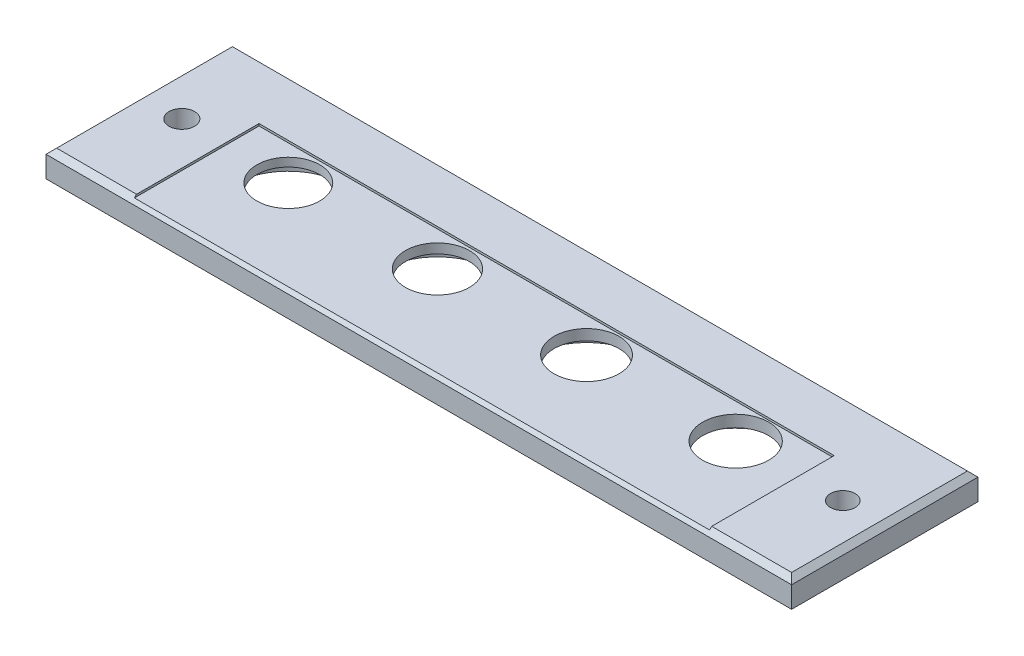
ISO-10303-21;
HEADER;
FILE_DESCRIPTION(('STEP AP214'),'2;1');
FILE_NAME('part.step','',(''),(''),'','','');
FILE_SCHEMA(('AUTOMOTIVE_DESIGN { 1 0 10303 214 1 1 1 1 }'));
ENDSEC;
DATA;
#1=APPLICATION_CONTEXT('core data for automotive mechanical design processes');
#2=APPLICATION_PROTOCOL_DEFINITION('international standard','automotive_design',2000,#1);
#3=PRODUCT_CONTEXT('',#1,'mechanical');
#4=PRODUCT('Part','Part','',(#3));
#5=PRODUCT_RELATED_PRODUCT_CATEGORY('part','',(#4));
#6=PRODUCT_DEFINITION_FORMATION('','',#4);
#7=PRODUCT_DEFINITION_CONTEXT('part definition',#1,'design');
#8=PRODUCT_DEFINITION('design','',#6,#7);
#9=PRODUCT_DEFINITION_SHAPE('','',#8);
#10=(LENGTH_UNIT() NAMED_UNIT(*) SI_UNIT(.MILLI.,.METRE.));
#11=(NAMED_UNIT(*) PLANE_ANGLE_UNIT() SI_UNIT($,.RADIAN.));
#12=(NAMED_UNIT(*) SI_UNIT($,.STERADIAN.) SOLID_ANGLE_UNIT());
#13=UNCERTAINTY_MEASURE_WITH_UNIT(LENGTH_MEASURE(1.E-05),#10,'distance_accuracy_value','');
#14=(GEOMETRIC_REPRESENTATION_CONTEXT(3) GLOBAL_UNCERTAINTY_ASSIGNED_CONTEXT((#13)) GLOBAL_UNIT_ASSIGNED_CONTEXT((#10,
#11,#12)) REPRESENTATION_CONTEXT('',''));
#15=CARTESIAN_POINT('',(0.,0.,0.));
#16=DIRECTION('',(0.,0.,1.));
#17=DIRECTION('',(1.,0.,0.));
#18=AXIS2_PLACEMENT_3D('',#15,#16,#17);
#19=CARTESIAN_POINT('',(28.,6.,-17.5));
#20=DIRECTION('',(0.,-1.,0.));
#21=DIRECTION('',(0.,0.,-1.));
#22=AXIS2_PLACEMENT_3D('',#19,#20,#21);
#23=CYLINDRICAL_SURFACE('',#22,5.9);
#24=CARTESIAN_POINT('',(28.,4.,-17.5));
#25=DIRECTION('',(0.,1.,0.));
#26=DIRECTION('',(0.,0.,1.));
#27=AXIS2_PLACEMENT_3D('',#24,#25,#26);
#28=CIRCLE('',#27,5.9);
#29=CARTESIAN_POINT('',(28.,4.,-11.6));
#30=VERTEX_POINT('',#29);
#31=EDGE_CURVE('E219',#30,#30,#28,.T.);
#32=ORIENTED_EDGE('',*,*,#31,.F.);
#33=EDGE_LOOP('',(#32));
#34=FACE_BOUND('',#33,.T.);
#35=CARTESIAN_POINT('',(28.,5.6,-17.5));
#36=DIRECTION('',(0.,1.,0.));
#37=DIRECTION('',(0.,0.,1.));
#38=AXIS2_PLACEMENT_3D('',#35,#36,#37);
#39=CIRCLE('',#38,5.9);
#40=CARTESIAN_POINT('',(28.,5.6,-11.6));
#41=VERTEX_POINT('',#40);
#42=EDGE_CURVE('E182',#41,#41,#39,.T.);
#43=ORIENTED_EDGE('',*,*,#42,.T.);
#44=EDGE_LOOP('',(#43));
#45=FACE_BOUND('',#44,.T.);
#46=ADVANCED_FACE('F41',(#34,#45),#23,.F.);
#47=CARTESIAN_POINT('',(56.,6.,-17.5));
#48=DIRECTION('',(0.,-1.,0.));
#49=DIRECTION('',(0.,0.,-1.));
#50=AXIS2_PLACEMENT_3D('',#47,#48,#49);
#51=CYLINDRICAL_SURFACE('',#50,6.);
#52=CARTESIAN_POINT('',(56.,3.8,-17.5));
#53=DIRECTION('',(0.,1.,0.));
#54=DIRECTION('',(0.,0.,1.));
#55=AXIS2_PLACEMENT_3D('',#52,#53,#54);
#56=CIRCLE('',#55,6.);
#57=CARTESIAN_POINT('',(56.,3.8,-11.5));
#58=VERTEX_POINT('',#57);
#59=EDGE_CURVE('E210',#58,#58,#56,.T.);
#60=ORIENTED_EDGE('',*,*,#59,.F.);
#61=EDGE_LOOP('',(#60));
#62=FACE_BOUND('',#61,.T.);
#63=CARTESIAN_POINT('',(56.,5.6,-17.5));
#64=DIRECTION('',(0.,1.,0.));
#65=DIRECTION('',(0.,0.,1.));
#66=AXIS2_PLACEMENT_3D('',#63,#64,#65);
#67=CIRCLE('',#66,6.);
#68=CARTESIAN_POINT('',(56.,5.6,-11.5));
#69=VERTEX_POINT('',#68);
#70=EDGE_CURVE('E178',#69,#69,#67,.T.);
#71=ORIENTED_EDGE('',*,*,#70,.T.);
#72=EDGE_LOOP('',(#71));
#73=FACE_BOUND('',#72,.T.);
#74=ADVANCED_FACE('F408',(#62,#73),#51,.F.);
#75=CARTESIAN_POINT('',(84.,6.,-17.5));
#76=DIRECTION('',(0.,-1.,0.));
#77=DIRECTION('',(0.,0.,-1.));
#78=AXIS2_PLACEMENT_3D('',#75,#76,#77);
#79=CYLINDRICAL_SURFACE('',#78,6.1);
#80=CARTESIAN_POINT('',(84.,3.6,-17.5));
#81=DIRECTION('',(0.,1.,0.));
#82=DIRECTION('',(0.,0.,1.));
#83=AXIS2_PLACEMENT_3D('',#80,#81,#82);
#84=CIRCLE('',#83,6.1);
#85=CARTESIAN_POINT('',(84.,3.6,-11.4));
#86=VERTEX_POINT('',#85);
#87=EDGE_CURVE('E201',#86,#86,#84,.T.);
#88=ORIENTED_EDGE('',*,*,#87,.F.);
#89=EDGE_LOOP('',(#88));
#90=FACE_BOUND('',#89,.T.);
#91=CARTESIAN_POINT('',(84.,5.6,-17.5));
#92=DIRECTION('',(0.,1.,0.));
#93=DIRECTION('',(0.,0.,1.));
#94=AXIS2_PLACEMENT_3D('',#91,#92,#93);
#95=CIRCLE('',#94,6.1);
#96=CARTESIAN_POINT('',(84.,5.6,-11.4));
#97=VERTEX_POINT('',#96);
#98=EDGE_CURVE('E174',#97,#97,#95,.T.);
#99=ORIENTED_EDGE('',*,*,#98,.T.);
#100=EDGE_LOOP('',(#99));
#101=FACE_BOUND('',#100,.T.);
#102=ADVANCED_FACE('F414',(#90,#101),#79,.F.);
#103=CARTESIAN_POINT('',(112.,6.,-17.5));
#104=DIRECTION('',(0.,-1.,0.));
#105=DIRECTION('',(0.,0.,-1.));
#106=AXIS2_PLACEMENT_3D('',#103,#104,#105);
#107=CYLINDRICAL_SURFACE('',#106,6.2);
#108=CARTESIAN_POINT('',(112.,3.4,-17.5));
#109=DIRECTION('',(0.,1.,0.));
#110=DIRECTION('',(0.,0.,1.));
#111=AXIS2_PLACEMENT_3D('',#108,#109,#110);
#112=CIRCLE('',#111,6.2);
#113=CARTESIAN_POINT('',(112.,3.4,-11.3));
#114=VERTEX_POINT('',#113);
#115=EDGE_CURVE('E191',#114,#114,#112,.T.);
#116=ORIENTED_EDGE('',*,*,#115,.F.);
#117=EDGE_LOOP('',(#116));
#118=FACE_BOUND('',#117,.T.);
#119=CARTESIAN_POINT('',(112.,5.6,-17.5));
#120=DIRECTION('',(0.,1.,0.));
#121=DIRECTION('',(0.,0.,1.));
#122=AXIS2_PLACEMENT_3D('',#119,#120,#121);
#123=CIRCLE('',#122,6.2);
#124=CARTESIAN_POINT('',(112.,5.6,-11.3));
#125=VERTEX_POINT('',#124);
#126=EDGE_CURVE('E169',#125,#125,#123,.T.);
#127=ORIENTED_EDGE('',*,*,#126,.T.);
#128=EDGE_LOOP('',(#127));
#129=FACE_BOUND('',#128,.T.);
#130=ADVANCED_FACE('F442',(#118,#129),#107,.F.);
#131=CARTESIAN_POINT('',(0.,6.,-35.));
#132=DIRECTION('',(1.,0.,0.));
#133=DIRECTION('',(0.,0.,-1.));
#134=AXIS2_PLACEMENT_3D('',#131,#132,#133);
#135=PLANE('',#134);
#136=DIRECTION('',(0.,-1.,0.));
#137=VECTOR('',#136,1.);
#138=CARTESIAN_POINT('',(0.,6.,0.));
#139=LINE('',#138,#137);
#140=CARTESIAN_POINT('',(0.,5.,0.));
#141=VERTEX_POINT('',#140);
#142=CARTESIAN_POINT('',(0.,0.999999999999987,0.));
#143=VERTEX_POINT('',#142);
#144=EDGE_CURVE('E252',#141,#143,#139,.T.);
#145=ORIENTED_EDGE('',*,*,#144,.F.);
#146=DIRECTION('',(0.,0.,-1.));
#147=VECTOR('',#146,1.);
#148=CARTESIAN_POINT('',(0.,5.,-35.));
#149=LINE('',#148,#147);
#150=CARTESIAN_POINT('',(0.,5.,-35.));
#151=VERTEX_POINT('',#150);
#152=EDGE_CURVE('E306',#141,#151,#149,.T.);
#153=ORIENTED_EDGE('',*,*,#152,.T.);
#154=DIRECTION('',(0.,-1.,0.));
#155=VECTOR('',#154,1.);
#156=CARTESIAN_POINT('',(0.,6.,-35.));
#157=LINE('',#156,#155);
#158=CARTESIAN_POINT('',(0.,0.999999999999987,-35.));
#159=VERTEX_POINT('',#158);
#160=EDGE_CURVE('E228',#151,#159,#157,.T.);
#161=ORIENTED_EDGE('',*,*,#160,.T.);
#162=DIRECTION('',(0.,0.,1.));
#163=VECTOR('',#162,1.);
#164=CARTESIAN_POINT('',(0.,0.999999999999987,-35.));
#165=LINE('',#164,#163);
#166=EDGE_CURVE('E303',#159,#143,#165,.T.);
#167=ORIENTED_EDGE('',*,*,#166,.T.);
#168=EDGE_LOOP('',(#145,#153,#161,#167));
#169=FACE_BOUND('',#168,.T.);
#170=ADVANCED_FACE('F372',(#169),#135,.F.);
#171=CARTESIAN_POINT('',(0.,6.,0.));
#172=DIRECTION('',(0.,0.,-1.));
#173=DIRECTION('',(-1.,0.,0.));
#174=AXIS2_PLACEMENT_3D('',#171,#172,#173);
#175=PLANE('',#174);
#176=DIRECTION('',(0.,-1.,0.));
#177=VECTOR('',#176,1.);
#178=CARTESIAN_POINT('',(140.,6.,0.));
#179=LINE('',#178,#177);
#180=CARTESIAN_POINT('',(140.,5.,0.));
#181=VERTEX_POINT('',#180);
#182=CARTESIAN_POINT('',(140.,0.999999999999987,0.));
#183=VERTEX_POINT('',#182);
#184=EDGE_CURVE('E248',#181,#183,#179,.T.);
#185=ORIENTED_EDGE('',*,*,#184,.F.);
#186=DIRECTION('',(-1.,0.,0.));
#187=VECTOR('',#186,1.);
#188=CARTESIAN_POINT('',(0.,5.,0.));
#189=LINE('',#188,#187);
#190=EDGE_CURVE('E300',#181,#141,#189,.T.);
#191=ORIENTED_EDGE('',*,*,#190,.T.);
#192=ORIENTED_EDGE('',*,*,#144,.T.);
#193=DIRECTION('',(1.,0.,0.));
#194=VECTOR('',#193,1.);
#195=CARTESIAN_POINT('',(0.,0.999999999999987,0.));
#196=LINE('',#195,#194);
#197=EDGE_CURVE('E297',#143,#183,#196,.T.);
#198=ORIENTED_EDGE('',*,*,#197,.T.);
#199=EDGE_LOOP('',(#185,#191,#192,#198));
#200=FACE_BOUND('',#199,.T.);
#201=ADVANCED_FACE('F396',(#200),#175,.F.);
#202=CARTESIAN_POINT('',(140.,6.,-35.));
#203=DIRECTION('',(-1.,0.,0.));
#204=DIRECTION('',(0.,0.,1.));
#205=AXIS2_PLACEMENT_3D('',#202,#203,#204);
#206=PLANE('',#205);
#207=DIRECTION('',(0.,-1.,0.));
#208=VECTOR('',#207,1.);
#209=CARTESIAN_POINT('',(140.,6.,-35.));
#210=LINE('',#209,#208);
#211=CARTESIAN_POINT('',(140.,5.,-35.));
#212=VERTEX_POINT('',#211);
#213=CARTESIAN_POINT('',(140.,0.999999999999987,-35.));
#214=VERTEX_POINT('',#213);
#215=EDGE_CURVE('E244',#212,#214,#210,.T.);
#216=ORIENTED_EDGE('',*,*,#215,.F.);
#217=DIRECTION('',(0.,0.,1.));
#218=VECTOR('',#217,1.);
#219=CARTESIAN_POINT('',(140.,5.,0.));
#220=LINE('',#219,#218);
#221=EDGE_CURVE('E287',#212,#181,#220,.T.);
#222=ORIENTED_EDGE('',*,*,#221,.T.);
#223=ORIENTED_EDGE('',*,*,#184,.T.);
#224=DIRECTION('',(0.,0.,-1.));
#225=VECTOR('',#224,1.);
#226=CARTESIAN_POINT('',(140.,0.999999999999987,-35.));
#227=LINE('',#226,#225);
#228=EDGE_CURVE('E283',#183,#214,#227,.T.);
#229=ORIENTED_EDGE('',*,*,#228,.T.);
#230=EDGE_LOOP('',(#216,#222,#223,#229));
#231=FACE_BOUND('',#230,.T.);
#232=ADVANCED_FACE('F384',(#231),#206,.F.);
#233=CARTESIAN_POINT('',(0.,6.,-35.));
#234=DIRECTION('',(0.,0.,1.));
#235=DIRECTION('',(1.,0.,0.));
#236=AXIS2_PLACEMENT_3D('',#233,#234,#235);
#237=PLANE('',#236);
#238=ORIENTED_EDGE('',*,*,#160,.F.);
#239=DIRECTION('',(1.,0.,0.));
#240=VECTOR('',#239,1.);
#241=CARTESIAN_POINT('',(140.,5.,-35.));
#242=LINE('',#241,#240);
#243=EDGE_CURVE('E294',#151,#212,#242,.T.);
#244=ORIENTED_EDGE('',*,*,#243,.T.);
#245=ORIENTED_EDGE('',*,*,#215,.T.);
#246=DIRECTION('',(-1.,0.,0.));
#247=VECTOR('',#246,1.);
#248=CARTESIAN_POINT('',(0.,0.999999999999987,-35.));
#249=LINE('',#248,#247);
#250=EDGE_CURVE('E291',#214,#159,#249,.T.);
#251=ORIENTED_EDGE('',*,*,#250,.T.);
#252=EDGE_LOOP('',(#238,#244,#245,#251));
#253=FACE_BOUND('',#252,.T.);
#254=ADVANCED_FACE('F375',(#253),#237,.F.);
#255=CARTESIAN_POINT('',(0.,6.,0.));
#256=DIRECTION('',(0.,1.,0.));
#257=DIRECTION('',(0.,0.,1.));
#258=AXIS2_PLACEMENT_3D('',#255,#256,#257);
#259=PLANE('',#258);
#260=DIRECTION('',(0.,0.,1.));
#261=VECTOR('',#260,1.);
#262=CARTESIAN_POINT('',(16.,6.,0.));
#263=LINE('',#262,#261);
#264=CARTESIAN_POINT('',(16.,6.,-24.));
#265=VERTEX_POINT('',#264);
#266=CARTESIAN_POINT('',(16.,6.,-0.999999999999987));
#267=VERTEX_POINT('',#266);
#268=EDGE_CURVE('E161',#265,#267,#263,.T.);
#269=ORIENTED_EDGE('',*,*,#268,.F.);
#270=DIRECTION('',(1.,0.,0.));
#271=VECTOR('',#270,1.);
#272=CARTESIAN_POINT('',(0.,6.,-24.));
#273=LINE('',#272,#271);
#274=CARTESIAN_POINT('',(124.,6.,-24.));
#275=VERTEX_POINT('',#274);
#276=EDGE_CURVE('E158',#265,#275,#273,.T.);
#277=ORIENTED_EDGE('',*,*,#276,.T.);
#278=DIRECTION('',(0.,0.,1.));
#279=VECTOR('',#278,1.);
#280=CARTESIAN_POINT('',(124.,6.,0.));
#281=LINE('',#280,#279);
#282=CARTESIAN_POINT('',(124.,6.,-0.999999999999987));
#283=VERTEX_POINT('',#282);
#284=EDGE_CURVE('E148',#275,#283,#281,.T.);
#285=ORIENTED_EDGE('',*,*,#284,.T.);
#286=DIRECTION('',(1.,0.,0.));
#287=VECTOR('',#286,1.);
#288=CARTESIAN_POINT('',(140.,6.,-0.999999999999987));
#289=LINE('',#288,#287);
#290=CARTESIAN_POINT('',(139.,6.,-0.999999999999987));
#291=VERTEX_POINT('',#290);
#292=EDGE_CURVE('E271',#283,#291,#289,.T.);
#293=ORIENTED_EDGE('',*,*,#292,.T.);
#294=DIRECTION('',(0.,0.,-1.));
#295=VECTOR('',#294,1.);
#296=CARTESIAN_POINT('',(139.,6.,-35.));
#297=LINE('',#296,#295);
#298=CARTESIAN_POINT('',(139.,6.,-34.));
#299=VERTEX_POINT('',#298);
#300=EDGE_CURVE('E279',#291,#299,#297,.T.);
#301=ORIENTED_EDGE('',*,*,#300,.T.);
#302=DIRECTION('',(-1.,0.,0.));
#303=VECTOR('',#302,1.);
#304=CARTESIAN_POINT('',(0.,6.,-34.));
#305=LINE('',#304,#303);
#306=CARTESIAN_POINT('',(0.999999999999987,6.,-34.));
#307=VERTEX_POINT('',#306);
#308=EDGE_CURVE('E276',#299,#307,#305,.T.);
#309=ORIENTED_EDGE('',*,*,#308,.T.);
#310=DIRECTION('',(0.,0.,1.));
#311=VECTOR('',#310,1.);
#312=CARTESIAN_POINT('',(0.999999999999987,6.,0.));
#313=LINE('',#312,#311);
#314=CARTESIAN_POINT('',(0.999999999999987,6.,-0.999999999999987));
#315=VERTEX_POINT('',#314);
#316=EDGE_CURVE('E256',#307,#315,#313,.T.);
#317=ORIENTED_EDGE('',*,*,#316,.T.);
#318=EDGE_CURVE('E272',#315,#267,#289,.T.);
#319=ORIENTED_EDGE('',*,*,#318,.T.);
#320=EDGE_LOOP('',(#269,#277,#285,#293,#301,#309,#317,#319));
#321=FACE_BOUND('',#320,.T.);
#322=CARTESIAN_POINT('',(8.,6.,-17.5));
#323=DIRECTION('',(0.,1.,0.));
#324=DIRECTION('',(0.,0.,1.));
#325=AXIS2_PLACEMENT_3D('',#322,#323,#324);
#326=CIRCLE('',#325,2.4);
#327=CARTESIAN_POINT('',(8.,6.,-15.1));
#328=VERTEX_POINT('',#327);
#329=EDGE_CURVE('E224',#328,#328,#326,.T.);
#330=ORIENTED_EDGE('',*,*,#329,.F.);
#331=EDGE_LOOP('',(#330));
#332=FACE_BOUND('',#331,.T.);
#333=CARTESIAN_POINT('',(132.11450506185,6.,-17.5));
#334=DIRECTION('',(0.,1.,0.));
#335=DIRECTION('',(0.,0.,1.));
#336=AXIS2_PLACEMENT_3D('',#333,#334,#335);
#337=CIRCLE('',#336,2.30000000000001);
#338=CARTESIAN_POINT('',(132.11450506185,6.,-15.2));
#339=VERTEX_POINT('',#338);
#340=EDGE_CURVE('E237',#339,#339,#337,.T.);
#341=ORIENTED_EDGE('',*,*,#340,.F.);
#342=EDGE_LOOP('',(#341));
#343=FACE_BOUND('',#342,.T.);
#344=ADVANCED_FACE('F356',(#321,#332,#343),#259,.T.);
#345=CARTESIAN_POINT('',(0.,0.,0.));
#346=DIRECTION('',(0.,1.,0.));
#347=DIRECTION('',(0.,0.,1.));
#348=AXIS2_PLACEMENT_3D('',#345,#346,#347);
#349=PLANE('',#348);
#350=DIRECTION('',(1.,0.,0.));
#351=VECTOR('',#350,1.);
#352=CARTESIAN_POINT('',(0.,0.,-34.));
#353=LINE('',#352,#351);
#354=CARTESIAN_POINT('',(1.,0.,-34.));
#355=VERTEX_POINT('',#354);
#356=CARTESIAN_POINT('',(139.,0.,-34.));
#357=VERTEX_POINT('',#356);
#358=EDGE_CURVE('E309',#355,#357,#353,.T.);
#359=ORIENTED_EDGE('',*,*,#358,.T.);
#360=DIRECTION('',(0.,0.,1.));
#361=VECTOR('',#360,1.);
#362=CARTESIAN_POINT('',(139.,0.,0.));
#363=LINE('',#362,#361);
#364=CARTESIAN_POINT('',(139.,0.,-1.));
#365=VERTEX_POINT('',#364);
#366=EDGE_CURVE('E318',#357,#365,#363,.T.);
#367=ORIENTED_EDGE('',*,*,#366,.T.);
#368=DIRECTION('',(-1.,0.,0.));
#369=VECTOR('',#368,1.);
#370=CARTESIAN_POINT('',(0.,0.,-1.));
#371=LINE('',#370,#369);
#372=CARTESIAN_POINT('',(1.,0.,-1.));
#373=VERTEX_POINT('',#372);
#374=EDGE_CURVE('E315',#365,#373,#371,.T.);
#375=ORIENTED_EDGE('',*,*,#374,.T.);
#376=DIRECTION('',(0.,0.,-1.));
#377=VECTOR('',#376,1.);
#378=CARTESIAN_POINT('',(1.,0.,0.));
#379=LINE('',#378,#377);
#380=EDGE_CURVE('E312',#373,#355,#379,.T.);
#381=ORIENTED_EDGE('',*,*,#380,.T.);
#382=EDGE_LOOP('',(#359,#367,#375,#381));
#383=FACE_BOUND('',#382,.T.);
#384=CARTESIAN_POINT('',(112.,0.,-17.5));
#385=DIRECTION('',(0.,1.,0.));
#386=DIRECTION('',(0.,0.,1.));
#387=AXIS2_PLACEMENT_3D('',#384,#385,#386);
#388=CIRCLE('',#387,10.9);
#389=CARTESIAN_POINT('',(112.,0.,-6.6));
#390=VERTEX_POINT('',#389);
#391=EDGE_CURVE('E192',#390,#390,#388,.T.);
#392=ORIENTED_EDGE('',*,*,#391,.T.);
#393=EDGE_LOOP('',(#392));
#394=FACE_BOUND('',#393,.T.);
#395=CARTESIAN_POINT('',(84.,0.,-17.5));
#396=DIRECTION('',(0.,1.,0.));
#397=DIRECTION('',(0.,0.,1.));
#398=AXIS2_PLACEMENT_3D('',#395,#396,#397);
#399=CIRCLE('',#398,10.8);
#400=CARTESIAN_POINT('',(84.,0.,-6.7));
#401=VERTEX_POINT('',#400);
#402=EDGE_CURVE('E202',#401,#401,#399,.T.);
#403=ORIENTED_EDGE('',*,*,#402,.T.);
#404=EDGE_LOOP('',(#403));
#405=FACE_BOUND('',#404,.T.);
#406=CARTESIAN_POINT('',(56.,0.,-17.5));
#407=DIRECTION('',(0.,1.,0.));
#408=DIRECTION('',(0.,0.,1.));
#409=AXIS2_PLACEMENT_3D('',#406,#407,#408);
#410=CIRCLE('',#409,10.7);
#411=CARTESIAN_POINT('',(56.,0.,-28.2));
#412=VERTEX_POINT('',#411);
#413=EDGE_CURVE('E211',#412,#412,#410,.T.);
#414=ORIENTED_EDGE('',*,*,#413,.T.);
#415=EDGE_LOOP('',(#414));
#416=FACE_BOUND('',#415,.T.);
#417=CARTESIAN_POINT('',(28.,0.,-17.5));
#418=DIRECTION('',(0.,1.,0.));
#419=DIRECTION('',(0.,0.,1.));
#420=AXIS2_PLACEMENT_3D('',#417,#418,#419);
#421=CIRCLE('',#420,10.6);
#422=CARTESIAN_POINT('',(28.,0.,-6.9));
#423=VERTEX_POINT('',#422);
#424=EDGE_CURVE('E220',#423,#423,#421,.T.);
#425=ORIENTED_EDGE('',*,*,#424,.T.);
#426=EDGE_LOOP('',(#425));
#427=FACE_BOUND('',#426,.T.);
#428=CARTESIAN_POINT('',(8.,0.,-17.5));
#429=DIRECTION('',(0.,1.,0.));
#430=DIRECTION('',(0.,0.,1.));
#431=AXIS2_PLACEMENT_3D('',#428,#429,#430);
#432=CIRCLE('',#431,2.4);
#433=CARTESIAN_POINT('',(8.,0.,-15.1));
#434=VERTEX_POINT('',#433);
#435=EDGE_CURVE('E229',#434,#434,#432,.T.);
#436=ORIENTED_EDGE('',*,*,#435,.T.);
#437=EDGE_LOOP('',(#436));
#438=FACE_BOUND('',#437,.T.);
#439=CARTESIAN_POINT('',(132.11450506185,0.,-17.5));
#440=DIRECTION('',(0.,1.,0.));
#441=DIRECTION('',(0.,0.,1.));
#442=AXIS2_PLACEMENT_3D('',#439,#440,#441);
#443=CIRCLE('',#442,2.30000000000001);
#444=CARTESIAN_POINT('',(132.11450506185,0.,-15.2));
#445=VERTEX_POINT('',#444);
#446=EDGE_CURVE('E233',#445,#445,#443,.T.);
#447=ORIENTED_EDGE('',*,*,#446,.T.);
#448=EDGE_LOOP('',(#447));
#449=FACE_BOUND('',#448,.T.);
#450=ADVANCED_FACE('F389',(#383,#394,#405,#416,#427,#438,#449),#349,.F.);
#451=CARTESIAN_POINT('',(132.11450506185,6.,-17.5));
#452=DIRECTION('',(0.,-1.,0.));
#453=DIRECTION('',(0.,0.,-1.));
#454=AXIS2_PLACEMENT_3D('',#451,#452,#453);
#455=CYLINDRICAL_SURFACE('',#454,2.30000000000001);
#456=ORIENTED_EDGE('',*,*,#340,.T.);
#457=EDGE_LOOP('',(#456));
#458=FACE_BOUND('',#457,.T.);
#459=ORIENTED_EDGE('',*,*,#446,.F.);
#460=EDGE_LOOP('',(#459));
#461=FACE_BOUND('',#460,.T.);
#462=ADVANCED_FACE('F425',(#458,#461),#455,.F.);
#463=CARTESIAN_POINT('',(8.,6.,-17.5));
#464=DIRECTION('',(0.,-1.,0.));
#465=DIRECTION('',(0.,0.,-1.));
#466=AXIS2_PLACEMENT_3D('',#463,#464,#465);
#467=CYLINDRICAL_SURFACE('',#466,2.4);
#468=ORIENTED_EDGE('',*,*,#329,.T.);
#469=EDGE_LOOP('',(#468));
#470=FACE_BOUND('',#469,.T.);
#471=ORIENTED_EDGE('',*,*,#435,.F.);
#472=EDGE_LOOP('',(#471));
#473=FACE_BOUND('',#472,.T.);
#474=ADVANCED_FACE('F421',(#470,#473),#467,.F.);
#475=CARTESIAN_POINT('',(28.,4.,-17.5));
#476=DIRECTION('',(0.,-1.,0.));
#477=DIRECTION('',(0.,0.,-1.));
#478=AXIS2_PLACEMENT_3D('',#475,#476,#477);
#479=CYLINDRICAL_SURFACE('',#478,10.6);
#480=CARTESIAN_POINT('',(28.,4.,-17.5));
#481=DIRECTION('',(0.,1.,0.));
#482=DIRECTION('',(0.,0.,1.));
#483=AXIS2_PLACEMENT_3D('',#480,#481,#482);
#484=CIRCLE('',#483,10.6);
#485=CARTESIAN_POINT('',(28.,4.,-6.9));
#486=VERTEX_POINT('',#485);
#487=EDGE_CURVE('E215',#486,#486,#484,.T.);
#488=ORIENTED_EDGE('',*,*,#487,.T.);
#489=EDGE_LOOP('',(#488));
#490=FACE_BOUND('',#489,.T.);
#491=ORIENTED_EDGE('',*,*,#424,.F.);
#492=EDGE_LOOP('',(#491));
#493=FACE_BOUND('',#492,.T.);
#494=ADVANCED_FACE('F424',(#490,#493),#479,.F.);
#495=CARTESIAN_POINT('',(28.,4.,-17.5));
#496=DIRECTION('',(0.,1.,0.));
#497=DIRECTION('',(0.,0.,1.));
#498=AXIS2_PLACEMENT_3D('',#495,#496,#497);
#499=PLANE('',#498);
#500=ORIENTED_EDGE('',*,*,#31,.T.);
#501=EDGE_LOOP('',(#500));
#502=FACE_BOUND('',#501,.T.);
#503=ORIENTED_EDGE('',*,*,#487,.F.);
#504=EDGE_LOOP('',(#503));
#505=FACE_BOUND('',#504,.T.);
#506=ADVANCED_FACE('F510',(#502,#505),#499,.F.);
#507=CARTESIAN_POINT('',(56.,3.8,-17.5));
#508=DIRECTION('',(0.,-1.,0.));
#509=DIRECTION('',(0.,0.,-1.));
#510=AXIS2_PLACEMENT_3D('',#507,#508,#509);
#511=CYLINDRICAL_SURFACE('',#510,10.7);
#512=CARTESIAN_POINT('',(56.,3.8,-17.5));
#513=DIRECTION('',(0.,1.,0.));
#514=DIRECTION('',(0.,0.,1.));
#515=AXIS2_PLACEMENT_3D('',#512,#513,#514);
#516=CIRCLE('',#515,10.7);
#517=CARTESIAN_POINT('',(56.,3.8,-28.2));
#518=VERTEX_POINT('',#517);
#519=EDGE_CURVE('E206',#518,#518,#516,.T.);
#520=CARTESIAN_POINT('',(56.,3.8,-28.2));
#521=CARTESIAN_POINT('',(56.,3.76041666666667,-28.2));
#522=CARTESIAN_POINT('',(56.,3.72083333333333,-28.2));
#523=CARTESIAN_POINT('',(56.,3.64166666666667,-28.2));
#524=CARTESIAN_POINT('',(56.,3.60208333333333,-28.2));
#525=CARTESIAN_POINT('',(56.,3.52291666666667,-28.2));
#526=CARTESIAN_POINT('',(56.,3.48333333333333,-28.2));
#527=CARTESIAN_POINT('',(56.,3.40416666666667,-28.2));
#528=CARTESIAN_POINT('',(56.,3.36458333333333,-28.2));
#529=CARTESIAN_POINT('',(56.,3.28541666666667,-28.2));
#530=CARTESIAN_POINT('',(56.,3.24583333333333,-28.2));
#531=CARTESIAN_POINT('',(56.,3.16666666666667,-28.2));
#532=CARTESIAN_POINT('',(56.,3.12708333333333,-28.2));
#533=CARTESIAN_POINT('',(56.,3.04791666666667,-28.2));
#534=CARTESIAN_POINT('',(56.,3.00833333333333,-28.2));
#535=CARTESIAN_POINT('',(56.,2.92916666666667,-28.2));
#536=CARTESIAN_POINT('',(56.,2.88958333333333,-28.2));
#537=CARTESIAN_POINT('',(56.,2.81041666666667,-28.2));
#538=CARTESIAN_POINT('',(56.,2.77083333333333,-28.2));
#539=CARTESIAN_POINT('',(56.,2.69166666666667,-28.2));
#540=CARTESIAN_POINT('',(56.,2.65208333333333,-28.2));
#541=CARTESIAN_POINT('',(56.,2.57291666666667,-28.2));
#542=CARTESIAN_POINT('',(56.,2.53333333333333,-28.2));
#543=CARTESIAN_POINT('',(56.,2.45416666666667,-28.2));
#544=CARTESIAN_POINT('',(56.,2.41458333333333,-28.2));
#545=CARTESIAN_POINT('',(56.,2.33541666666667,-28.2));
#546=CARTESIAN_POINT('',(56.,2.29583333333333,-28.2));
#547=CARTESIAN_POINT('',(56.,2.21666666666667,-28.2));
#548=CARTESIAN_POINT('',(56.,2.17708333333333,-28.2));
#549=CARTESIAN_POINT('',(56.,2.09791666666667,-28.2));
#550=CARTESIAN_POINT('',(56.,2.05833333333333,-28.2));
#551=CARTESIAN_POINT('',(56.,1.97916666666667,-28.2));
#552=CARTESIAN_POINT('',(56.,1.93958333333333,-28.2));
#553=CARTESIAN_POINT('',(56.,1.86041666666667,-28.2));
#554=CARTESIAN_POINT('',(56.,1.82083333333333,-28.2));
#555=CARTESIAN_POINT('',(56.,1.74166666666667,-28.2));
#556=CARTESIAN_POINT('',(56.,1.70208333333333,-28.2));
#557=CARTESIAN_POINT('',(56.,1.62291666666667,-28.2));
#558=CARTESIAN_POINT('',(56.,1.58333333333333,-28.2));
#559=CARTESIAN_POINT('',(56.,1.50416666666667,-28.2));
#560=CARTESIAN_POINT('',(56.,1.46458333333333,-28.2));
#561=CARTESIAN_POINT('',(56.,1.38541666666667,-28.2));
#562=CARTESIAN_POINT('',(56.,1.34583333333333,-28.2));
#563=CARTESIAN_POINT('',(56.,1.26666666666667,-28.2));
#564=CARTESIAN_POINT('',(56.,1.22708333333333,-28.2));
#565=CARTESIAN_POINT('',(56.,1.14791666666667,-28.2));
#566=CARTESIAN_POINT('',(56.,1.10833333333333,-28.2));
#567=CARTESIAN_POINT('',(56.,1.02916666666667,-28.2));
#568=CARTESIAN_POINT('',(56.,0.989583333333334,-28.2));
#569=CARTESIAN_POINT('',(56.,0.910416666666667,-28.2));
#570=CARTESIAN_POINT('',(56.,0.870833333333333,-28.2));
#571=CARTESIAN_POINT('',(56.,0.791666666666667,-28.2));
#572=CARTESIAN_POINT('',(56.,0.752083333333333,-28.2));
#573=CARTESIAN_POINT('',(56.,0.672916666666667,-28.2));
#574=CARTESIAN_POINT('',(56.,0.633333333333333,-28.2));
#575=CARTESIAN_POINT('',(56.,0.554166666666667,-28.2));
#576=CARTESIAN_POINT('',(56.,0.514583333333334,-28.2));
#577=CARTESIAN_POINT('',(56.,0.435416666666667,-28.2));
#578=CARTESIAN_POINT('',(56.,0.395833333333334,-28.2));
#579=CARTESIAN_POINT('',(56.,0.316666666666667,-28.2));
#580=CARTESIAN_POINT('',(56.,0.277083333333333,-28.2));
#581=CARTESIAN_POINT('',(56.,0.197916666666667,-28.2));
#582=CARTESIAN_POINT('',(56.,0.158333333333333,-28.2));
#583=CARTESIAN_POINT('',(56.,0.0791666666666666,-28.2));
#584=CARTESIAN_POINT('',(56.,0.0395833333333333,-28.2));
#585=CARTESIAN_POINT('',(56.,0.,-28.2));
#586=B_SPLINE_CURVE_WITH_KNOTS('',3,(#520,#521,#522,#523,#524,#525,#526,#527,#528,#529,#530,
#531,#532,#533,#534,#535,#536,#537,#538,#539,#540,#541,#542,#543,#544,#545,#546,#547,#548,#549,
#550,#551,#552,#553,#554,#555,#556,#557,#558,#559,#560,#561,#562,#563,#564,#565,#566,#567,#568,
#569,#570,#571,#572,#573,#574,#575,#576,#577,#578,#579,#580,#581,#582,#583,#584,#585),
.UNSPECIFIED.,.F.,.F.,(4,2,2,2,2,2,2,2,2,2,2,2,2,2,2,2,2,2,2,2,2,2,2,2,2,2,2,2,2,2,2,2,4),(0.,
0.11875,0.2375,0.35625,0.475,0.59375,0.7125,0.83125,0.95,1.06875,1.1875,1.30625,1.425,1.54375,
1.6625,1.78125,1.9,2.01875,2.1375,2.25625,2.375,2.49375,2.6125,2.73125,2.85,2.96875,3.0875,
3.20625,3.325,3.44375,3.5625,3.68125,3.8),.UNSPECIFIED.);
#587=EDGE_CURVE('BSEAM506',#518,#412,#586,.T.);
#588=ORIENTED_EDGE('',*,*,#519,.T.);
#589=ORIENTED_EDGE('',*,*,#413,.F.);
#590=ORIENTED_EDGE('',*,*,#587,.T.);
#591=ORIENTED_EDGE('',*,*,#587,.F.);
#592=EDGE_LOOP('',(#588,#590,#589,#591));
#593=FACE_BOUND('',#592,.T.);
#594=ADVANCED_FACE('F506',(#593),#511,.F.);
#595=CARTESIAN_POINT('',(56.,3.8,-17.5));
#596=DIRECTION('',(0.,1.,0.));
#597=DIRECTION('',(0.,0.,1.));
#598=AXIS2_PLACEMENT_3D('',#595,#596,#597);
#599=PLANE('',#598);
#600=ORIENTED_EDGE('',*,*,#59,.T.);
#601=EDGE_LOOP('',(#600));
#602=FACE_BOUND('',#601,.T.);
#603=ORIENTED_EDGE('',*,*,#519,.F.);
#604=EDGE_LOOP('',(#603));
#605=FACE_BOUND('',#604,.T.);
#606=ADVANCED_FACE('F502',(#602,#605),#599,.F.);
#607=CARTESIAN_POINT('',(84.,3.6,-17.5));
#608=DIRECTION('',(0.,-1.,0.));
#609=DIRECTION('',(0.,0.,-1.));
#610=AXIS2_PLACEMENT_3D('',#607,#608,#609);
#611=CYLINDRICAL_SURFACE('',#610,10.8);
#612=CARTESIAN_POINT('',(84.,3.6,-17.5));
#613=DIRECTION('',(0.,1.,0.));
#614=DIRECTION('',(0.,0.,1.));
#615=AXIS2_PLACEMENT_3D('',#612,#613,#614);
#616=CIRCLE('',#615,10.8);
#617=CARTESIAN_POINT('',(84.,3.6,-6.7));
#618=VERTEX_POINT('',#617);
#619=EDGE_CURVE('E197',#618,#618,#616,.T.);
#620=ORIENTED_EDGE('',*,*,#619,.T.);
#621=EDGE_LOOP('',(#620));
#622=FACE_BOUND('',#621,.T.);
#623=ORIENTED_EDGE('',*,*,#402,.F.);
#624=EDGE_LOOP('',(#623));
#625=FACE_BOUND('',#624,.T.);
#626=ADVANCED_FACE('F498',(#622,#625),#611,.F.);
#627=CARTESIAN_POINT('',(84.,3.6,-17.5));
#628=DIRECTION('',(0.,1.,0.));
#629=DIRECTION('',(0.,0.,1.));
#630=AXIS2_PLACEMENT_3D('',#627,#628,#629);
#631=PLANE('',#630);
#632=ORIENTED_EDGE('',*,*,#87,.T.);
#633=EDGE_LOOP('',(#632));
#634=FACE_BOUND('',#633,.T.);
#635=ORIENTED_EDGE('',*,*,#619,.F.);
#636=EDGE_LOOP('',(#635));
#637=FACE_BOUND('',#636,.T.);
#638=ADVANCED_FACE('F494',(#634,#637),#631,.F.);
#639=CARTESIAN_POINT('',(112.,3.4,-17.5));
#640=DIRECTION('',(0.,-1.,0.));
#641=DIRECTION('',(0.,0.,-1.));
#642=AXIS2_PLACEMENT_3D('',#639,#640,#641);
#643=CYLINDRICAL_SURFACE('',#642,10.9);
#644=CARTESIAN_POINT('',(112.,3.4,-17.5));
#645=DIRECTION('',(0.,1.,0.));
#646=DIRECTION('',(0.,0.,1.));
#647=AXIS2_PLACEMENT_3D('',#644,#645,#646);
#648=CIRCLE('',#647,10.9);
#649=CARTESIAN_POINT('',(112.,3.4,-6.6));
#650=VERTEX_POINT('',#649);
#651=EDGE_CURVE('E187',#650,#650,#648,.T.);
#652=ORIENTED_EDGE('',*,*,#651,.T.);
#653=EDGE_LOOP('',(#652));
#654=FACE_BOUND('',#653,.T.);
#655=ORIENTED_EDGE('',*,*,#391,.F.);
#656=EDGE_LOOP('',(#655));
#657=FACE_BOUND('',#656,.T.);
#658=ADVANCED_FACE('F490',(#654,#657),#643,.F.);
#659=CARTESIAN_POINT('',(112.,3.4,-17.5));
#660=DIRECTION('',(0.,1.,0.));
#661=DIRECTION('',(0.,0.,1.));
#662=AXIS2_PLACEMENT_3D('',#659,#660,#661);
#663=PLANE('',#662);
#664=ORIENTED_EDGE('',*,*,#115,.T.);
#665=EDGE_LOOP('',(#664));
#666=FACE_BOUND('',#665,.T.);
#667=ORIENTED_EDGE('',*,*,#651,.F.);
#668=EDGE_LOOP('',(#667));
#669=FACE_BOUND('',#668,.T.);
#670=ADVANCED_FACE('F466',(#666,#669),#663,.F.);
#671=CARTESIAN_POINT('',(0.999999999999987,6.,0.));
#672=DIRECTION('',(-0.707106781186552,0.707106781186543,0.));
#673=DIRECTION('',(0.,0.,-1.));
#674=AXIS2_PLACEMENT_3D('',#671,#672,#673);
#675=PLANE('',#674);
#676=DIRECTION('',(-0.577350269189623,-0.577350269189631,-0.577350269189623));
#677=VECTOR('',#676,1.);
#678=CARTESIAN_POINT('',(12.3333333333332,17.3333333333334,-22.6666666666668));
#679=LINE('',#678,#677);
#680=EDGE_CURVE('E329',#151,#307,#679,.F.);
#681=ORIENTED_EDGE('',*,*,#680,.F.);
#682=ORIENTED_EDGE('',*,*,#152,.F.);
#683=DIRECTION('',(0.577350269189623,0.577350269189631,-0.577350269189623));
#684=VECTOR('',#683,1.);
#685=CARTESIAN_POINT('',(0.666666666666661,5.66666666666667,-0.666666666666661));
#686=LINE('',#685,#684);
#687=EDGE_CURVE('E196',#315,#141,#686,.F.);
#688=ORIENTED_EDGE('',*,*,#687,.F.);
#689=ORIENTED_EDGE('',*,*,#316,.F.);
#690=EDGE_LOOP('',(#681,#682,#688,#689));
#691=FACE_BOUND('',#690,.T.);
#692=ADVANCED_FACE('F367',(#691),#675,.T.);
#693=CARTESIAN_POINT('',(0.,6.,-0.999999999999987));
#694=DIRECTION('',(0.,0.707106781186543,0.707106781186552));
#695=DIRECTION('',(-1.,0.,0.));
#696=AXIS2_PLACEMENT_3D('',#693,#694,#695);
#697=PLANE('',#696);
#698=DIRECTION('',(0.,-0.707106781186552,0.707106781186543));
#699=VECTOR('',#698,1.);
#700=CARTESIAN_POINT('',(16.,6.,-0.999999999999987));
#701=LINE('',#700,#699);
#702=CARTESIAN_POINT('',(16.,5.6,-0.599999999999992));
#703=VERTEX_POINT('',#702);
#704=EDGE_CURVE('E11',#267,#703,#701,.T.);
#705=ORIENTED_EDGE('',*,*,#704,.F.);
#706=ORIENTED_EDGE('',*,*,#318,.F.);
#707=ORIENTED_EDGE('',*,*,#687,.T.);
#708=ORIENTED_EDGE('',*,*,#190,.F.);
#709=DIRECTION('',(-0.577350269189628,0.577350269189628,-0.57735026918962));
#710=VECTOR('',#709,1.);
#711=CARTESIAN_POINT('',(92.6666666666663,52.3333333333338,-47.3333333333331));
#712=LINE('',#711,#710);
#713=EDGE_CURVE('E325',#291,#181,#712,.F.);
#714=ORIENTED_EDGE('',*,*,#713,.F.);
#715=ORIENTED_EDGE('',*,*,#292,.F.);
#716=DIRECTION('',(0.,-0.707106781186552,0.707106781186543));
#717=VECTOR('',#716,1.);
#718=CARTESIAN_POINT('',(124.,6.,-0.999999999999987));
#719=LINE('',#718,#717);
#720=CARTESIAN_POINT('',(124.,5.6,-0.599999999999992));
#721=VERTEX_POINT('',#720);
#722=EDGE_CURVE('E51',#283,#721,#719,.T.);
#723=ORIENTED_EDGE('',*,*,#722,.T.);
#724=DIRECTION('',(-1.,0.,0.));
#725=VECTOR('',#724,1.);
#726=CARTESIAN_POINT('',(0.,5.6,-0.599999999999992));
#727=LINE('',#726,#725);
#728=EDGE_CURVE('E154',#721,#703,#727,.T.);
#729=ORIENTED_EDGE('',*,*,#728,.T.);
#730=EDGE_LOOP('',(#705,#706,#707,#708,#714,#715,#723,#729));
#731=FACE_BOUND('',#730,.T.);
#732=ADVANCED_FACE('F352',(#731),#697,.T.);
#733=CARTESIAN_POINT('',(0.,6.,-34.));
#734=DIRECTION('',(0.,0.707106781186543,-0.707106781186552));
#735=DIRECTION('',(1.,0.,0.));
#736=AXIS2_PLACEMENT_3D('',#733,#734,#735);
#737=PLANE('',#736);
#738=ORIENTED_EDGE('',*,*,#680,.T.);
#739=ORIENTED_EDGE('',*,*,#308,.F.);
#740=DIRECTION('',(0.577350269189628,-0.577350269189628,-0.57735026918962));
#741=VECTOR('',#740,1.);
#742=CARTESIAN_POINT('',(92.6666666666663,52.3333333333338,12.3333333333331));
#743=LINE('',#742,#741);
#744=EDGE_CURVE('E322',#212,#299,#743,.F.);
#745=ORIENTED_EDGE('',*,*,#744,.F.);
#746=ORIENTED_EDGE('',*,*,#243,.F.);
#747=EDGE_LOOP('',(#738,#739,#745,#746));
#748=FACE_BOUND('',#747,.T.);
#749=ADVANCED_FACE('F449',(#748),#737,.T.);
#750=CARTESIAN_POINT('',(139.,6.,0.));
#751=DIRECTION('',(0.707106781186547,0.707106781186547,0.));
#752=DIRECTION('',(0.,0.,1.));
#753=AXIS2_PLACEMENT_3D('',#750,#751,#752);
#754=PLANE('',#753);
#755=ORIENTED_EDGE('',*,*,#713,.T.);
#756=ORIENTED_EDGE('',*,*,#221,.F.);
#757=ORIENTED_EDGE('',*,*,#744,.T.);
#758=ORIENTED_EDGE('',*,*,#300,.F.);
#759=EDGE_LOOP('',(#755,#756,#757,#758));
#760=FACE_BOUND('',#759,.T.);
#761=ADVANCED_FACE('F405',(#760),#754,.T.);
#762=CARTESIAN_POINT('',(0.,0.999999999999987,-35.));
#763=DIRECTION('',(0.707106781186543,0.707106781186552,0.));
#764=DIRECTION('',(0.,0.,1.));
#765=AXIS2_PLACEMENT_3D('',#762,#763,#764);
#766=PLANE('',#765);
#767=DIRECTION('',(-0.577350269189628,0.57735026918962,-0.577350269189628));
#768=VECTOR('',#767,1.);
#769=CARTESIAN_POINT('',(0.,0.999999999999987,-35.));
#770=LINE('',#769,#768);
#771=EDGE_CURVE('E340',#355,#159,#770,.T.);
#772=ORIENTED_EDGE('',*,*,#771,.F.);
#773=ORIENTED_EDGE('',*,*,#380,.F.);
#774=DIRECTION('',(-0.577350269189628,0.57735026918962,0.577350269189628));
#775=VECTOR('',#774,1.);
#776=CARTESIAN_POINT('',(11.6666666666668,-10.6666666666666,-11.6666666666668));
#777=LINE('',#776,#775);
#778=EDGE_CURVE('E326',#143,#373,#777,.F.);
#779=ORIENTED_EDGE('',*,*,#778,.F.);
#780=ORIENTED_EDGE('',*,*,#166,.F.);
#781=EDGE_LOOP('',(#772,#773,#779,#780));
#782=FACE_BOUND('',#781,.T.);
#783=ADVANCED_FACE('F44',(#782),#766,.F.);
#784=CARTESIAN_POINT('',(0.,0.999999999999987,0.));
#785=DIRECTION('',(0.,0.707106781186552,-0.707106781186543));
#786=DIRECTION('',(1.,0.,0.));
#787=AXIS2_PLACEMENT_3D('',#784,#785,#786);
#788=PLANE('',#787);
#789=ORIENTED_EDGE('',*,*,#778,.T.);
#790=ORIENTED_EDGE('',*,*,#374,.F.);
#791=DIRECTION('',(0.577350269189628,0.57735026918962,0.577350269189628));
#792=VECTOR('',#791,1.);
#793=CARTESIAN_POINT('',(93.3333333333329,-45.6666666666665,-46.6666666666671));
#794=LINE('',#793,#792);
#795=EDGE_CURVE('E65',#183,#365,#794,.F.);
#796=ORIENTED_EDGE('',*,*,#795,.F.);
#797=ORIENTED_EDGE('',*,*,#197,.F.);
#798=EDGE_LOOP('',(#789,#790,#796,#797));
#799=FACE_BOUND('',#798,.T.);
#800=ADVANCED_FACE('F398',(#799),#788,.F.);
#801=CARTESIAN_POINT('',(0.,0.999999999999987,-35.));
#802=DIRECTION('',(0.,0.707106781186552,0.707106781186543));
#803=DIRECTION('',(-1.,0.,0.));
#804=AXIS2_PLACEMENT_3D('',#801,#802,#803);
#805=PLANE('',#804);
#806=ORIENTED_EDGE('',*,*,#771,.T.);
#807=ORIENTED_EDGE('',*,*,#250,.F.);
#808=DIRECTION('',(-0.577350269189628,-0.57735026918962,0.577350269189628));
#809=VECTOR('',#808,1.);
#810=CARTESIAN_POINT('',(93.3333333333329,-45.6666666666665,11.6666666666671));
#811=LINE('',#810,#809);
#812=EDGE_CURVE('E186',#357,#214,#811,.F.);
#813=ORIENTED_EDGE('',*,*,#812,.F.);
#814=ORIENTED_EDGE('',*,*,#358,.F.);
#815=EDGE_LOOP('',(#806,#807,#813,#814));
#816=FACE_BOUND('',#815,.T.);
#817=ADVANCED_FACE('F380',(#816),#805,.F.);
#818=CARTESIAN_POINT('',(140.,0.999999999999987,-35.));
#819=DIRECTION('',(-0.707106781186543,0.707106781186552,0.));
#820=DIRECTION('',(0.,0.,-1.));
#821=AXIS2_PLACEMENT_3D('',#818,#819,#820);
#822=PLANE('',#821);
#823=ORIENTED_EDGE('',*,*,#795,.T.);
#824=ORIENTED_EDGE('',*,*,#366,.F.);
#825=ORIENTED_EDGE('',*,*,#812,.T.);
#826=ORIENTED_EDGE('',*,*,#228,.F.);
#827=EDGE_LOOP('',(#823,#824,#825,#826));
#828=FACE_BOUND('',#827,.T.);
#829=ADVANCED_FACE('F387',(#828),#822,.F.);
#830=CARTESIAN_POINT('',(16.,5.6,0.));
#831=DIRECTION('',(-1.,0.,0.));
#832=DIRECTION('',(0.,0.,1.));
#833=AXIS2_PLACEMENT_3D('',#830,#831,#832);
#834=PLANE('',#833);
#835=ORIENTED_EDGE('',*,*,#704,.T.);
#836=DIRECTION('',(0.,0.,1.));
#837=VECTOR('',#836,1.);
#838=CARTESIAN_POINT('',(16.,5.6,0.));
#839=LINE('',#838,#837);
#840=CARTESIAN_POINT('',(16.,5.6,-24.));
#841=VERTEX_POINT('',#840);
#842=EDGE_CURVE('E58',#841,#703,#839,.T.);
#843=ORIENTED_EDGE('',*,*,#842,.F.);
#844=DIRECTION('',(0.,1.,0.));
#845=VECTOR('',#844,1.);
#846=CARTESIAN_POINT('',(16.,5.6,-24.));
#847=LINE('',#846,#845);
#848=EDGE_CURVE('E138',#841,#265,#847,.T.);
#849=ORIENTED_EDGE('',*,*,#848,.T.);
#850=ORIENTED_EDGE('',*,*,#268,.T.);
#851=EDGE_LOOP('',(#835,#843,#849,#850));
#852=FACE_BOUND('',#851,.T.);
#853=ADVANCED_FACE('F360',(#852),#834,.F.);
#854=CARTESIAN_POINT('',(0.,5.6,-24.));
#855=DIRECTION('',(0.,0.,1.));
#856=DIRECTION('',(1.,0.,0.));
#857=AXIS2_PLACEMENT_3D('',#854,#855,#856);
#858=PLANE('',#857);
#859=ORIENTED_EDGE('',*,*,#276,.F.);
#860=ORIENTED_EDGE('',*,*,#848,.F.);
#861=DIRECTION('',(1.,0.,0.));
#862=VECTOR('',#861,1.);
#863=CARTESIAN_POINT('',(0.,5.6,-24.));
#864=LINE('',#863,#862);
#865=CARTESIAN_POINT('',(124.,5.6,-24.));
#866=VERTEX_POINT('',#865);
#867=EDGE_CURVE('E132',#841,#866,#864,.T.);
#868=ORIENTED_EDGE('',*,*,#867,.T.);
#869=DIRECTION('',(0.,1.,0.));
#870=VECTOR('',#869,1.);
#871=CARTESIAN_POINT('',(124.,5.6,-24.));
#872=LINE('',#871,#870);
#873=EDGE_CURVE('E136',#866,#275,#872,.T.);
#874=ORIENTED_EDGE('',*,*,#873,.T.);
#875=EDGE_LOOP('',(#859,#860,#868,#874));
#876=FACE_BOUND('',#875,.T.);
#877=ADVANCED_FACE('F135',(#876),#858,.T.);
#878=CARTESIAN_POINT('',(124.,5.6,0.));
#879=DIRECTION('',(-1.,0.,0.));
#880=DIRECTION('',(0.,0.,1.));
#881=AXIS2_PLACEMENT_3D('',#878,#879,#880);
#882=PLANE('',#881);
#883=ORIENTED_EDGE('',*,*,#284,.F.);
#884=ORIENTED_EDGE('',*,*,#873,.F.);
#885=DIRECTION('',(0.,0.,1.));
#886=VECTOR('',#885,1.);
#887=CARTESIAN_POINT('',(124.,5.6,0.));
#888=LINE('',#887,#886);
#889=EDGE_CURVE('E141',#866,#721,#888,.T.);
#890=ORIENTED_EDGE('',*,*,#889,.T.);
#891=ORIENTED_EDGE('',*,*,#722,.F.);
#892=EDGE_LOOP('',(#883,#884,#890,#891));
#893=FACE_BOUND('',#892,.T.);
#894=ADVANCED_FACE('F145',(#893),#882,.T.);
#895=CARTESIAN_POINT('',(0.,5.6,0.));
#896=DIRECTION('',(0.,1.,0.));
#897=DIRECTION('',(0.,0.,1.));
#898=AXIS2_PLACEMENT_3D('',#895,#896,#897);
#899=PLANE('',#898);
#900=ORIENTED_EDGE('',*,*,#42,.F.);
#901=EDGE_LOOP('',(#900));
#902=FACE_BOUND('',#901,.T.);
#903=ORIENTED_EDGE('',*,*,#70,.F.);
#904=EDGE_LOOP('',(#903));
#905=FACE_BOUND('',#904,.T.);
#906=ORIENTED_EDGE('',*,*,#98,.F.);
#907=EDGE_LOOP('',(#906));
#908=FACE_BOUND('',#907,.T.);
#909=ORIENTED_EDGE('',*,*,#126,.F.);
#910=EDGE_LOOP('',(#909));
#911=FACE_BOUND('',#910,.T.);
#912=ORIENTED_EDGE('',*,*,#889,.F.);
#913=ORIENTED_EDGE('',*,*,#867,.F.);
#914=ORIENTED_EDGE('',*,*,#842,.T.);
#915=ORIENTED_EDGE('',*,*,#728,.F.);
#916=EDGE_LOOP('',(#912,#913,#914,#915));
#917=FACE_BOUND('',#916,.T.);
#918=ADVANCED_FACE('F152',(#902,#905,#908,#911,#917),#899,.T.);
#919=CLOSED_SHELL('',(#46,#74,#102,#130,#170,#201,#232,#254,#344,#450,#462,#474,#494,#506,#594,
#606,#626,#638,#658,#670,#692,#732,#749,#761,#783,#800,#817,#829,#853,#877,#894,#918));
#920=MANIFOLD_SOLID_BREP('B2',#919);
#921=ADVANCED_BREP_SHAPE_REPRESENTATION('',(#18,#920),#14);
#922=SHAPE_DEFINITION_REPRESENTATION(#9,#921);
ENDSEC;
END-ISO-10303-21;
